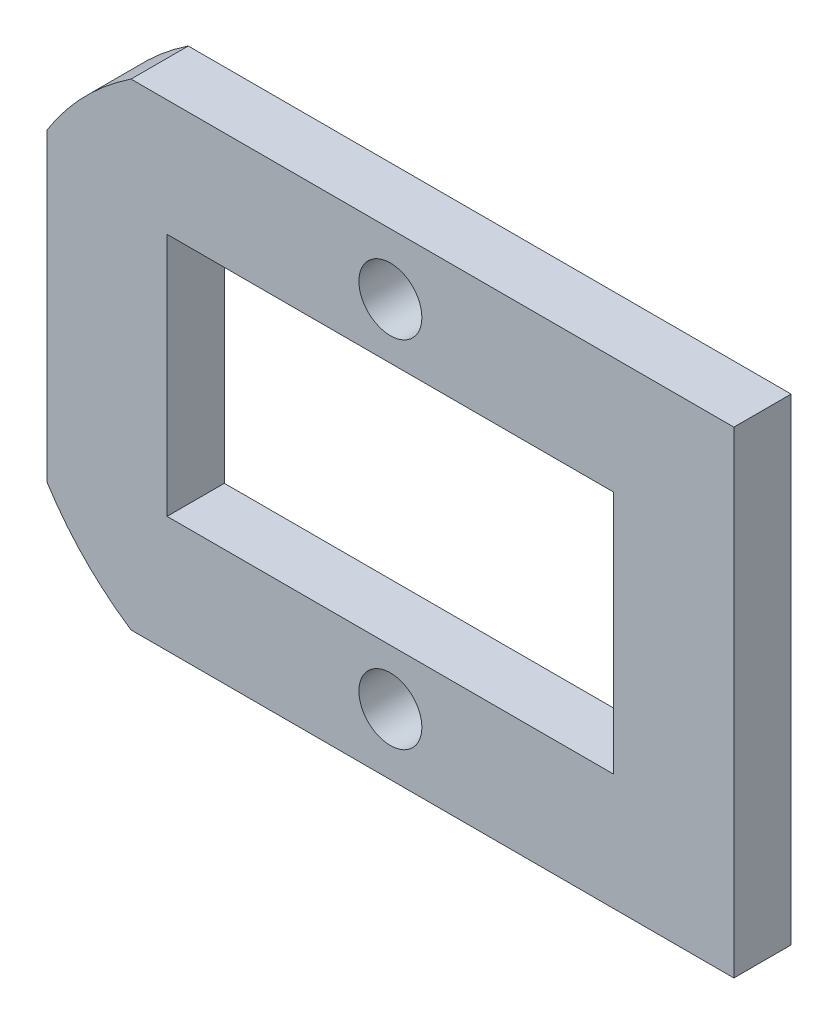
ISO-10303-21;
HEADER;
FILE_DESCRIPTION(('STEP AP214'),'2;1');
FILE_NAME('part.step','',(''),(''),'','','');
FILE_SCHEMA(('AUTOMOTIVE_DESIGN { 1 0 10303 214 1 1 1 1 }'));
ENDSEC;
DATA;
#1=APPLICATION_CONTEXT('core data for automotive mechanical design processes');
#2=APPLICATION_PROTOCOL_DEFINITION('international standard','automotive_design',2000,#1);
#3=PRODUCT_CONTEXT('',#1,'mechanical');
#4=PRODUCT('Part','Part','',(#3));
#5=PRODUCT_RELATED_PRODUCT_CATEGORY('part','',(#4));
#6=PRODUCT_DEFINITION_FORMATION('','',#4);
#7=PRODUCT_DEFINITION_CONTEXT('part definition',#1,'design');
#8=PRODUCT_DEFINITION('design','',#6,#7);
#9=PRODUCT_DEFINITION_SHAPE('','',#8);
#10=(LENGTH_UNIT() NAMED_UNIT(*) SI_UNIT(.MILLI.,.METRE.));
#11=(NAMED_UNIT(*) PLANE_ANGLE_UNIT() SI_UNIT($,.RADIAN.));
#12=(NAMED_UNIT(*) SI_UNIT($,.STERADIAN.) SOLID_ANGLE_UNIT());
#13=UNCERTAINTY_MEASURE_WITH_UNIT(LENGTH_MEASURE(1.E-05),#10,'distance_accuracy_value','');
#14=(GEOMETRIC_REPRESENTATION_CONTEXT(3) GLOBAL_UNCERTAINTY_ASSIGNED_CONTEXT((#13)) GLOBAL_UNIT_ASSIGNED_CONTEXT((#10,
#11,#12)) REPRESENTATION_CONTEXT('',''));
#15=CARTESIAN_POINT('',(0.,0.,0.));
#16=DIRECTION('',(0.,0.,1.));
#17=DIRECTION('',(1.,0.,0.));
#18=AXIS2_PLACEMENT_3D('',#15,#16,#17);
#19=CARTESIAN_POINT('',(-118.1,25.3,-11.45));
#20=DIRECTION('',(0.,0.,1.));
#21=DIRECTION('',(1.,0.,0.));
#22=AXIS2_PLACEMENT_3D('',#19,#20,#21);
#23=CYLINDRICAL_SURFACE('',#22,1.65);
#24=DIRECTION('',(0.,0.,1.));
#25=VECTOR('',#24,1.);
#26=CARTESIAN_POINT('',(-116.45,25.3,-11.45));
#27=LINE('',#26,#25);
#28=CARTESIAN_POINT('',(-116.45,25.3,-10.45));
#29=VERTEX_POINT('',#28);
#30=CARTESIAN_POINT('',(-116.45,25.3,-7.45));
#31=VERTEX_POINT('',#30);
#32=EDGE_CURVE('E10',#29,#31,#27,.T.);
#33=ORIENTED_EDGE('',*,*,#32,.F.);
#34=CARTESIAN_POINT('',(-118.1,25.3,-10.45));
#35=DIRECTION('',(0.,0.,1.));
#36=DIRECTION('',(1.,0.,0.));
#37=AXIS2_PLACEMENT_3D('',#34,#35,#36);
#38=CIRCLE('',#37,1.65);
#39=EDGE_CURVE('E215',#29,#29,#38,.T.);
#40=ORIENTED_EDGE('',*,*,#39,.F.);
#41=ORIENTED_EDGE('',*,*,#32,.T.);
#42=CARTESIAN_POINT('',(-118.1,25.3,-7.45));
#43=DIRECTION('',(0.,0.,1.));
#44=DIRECTION('',(1.,0.,0.));
#45=AXIS2_PLACEMENT_3D('',#42,#43,#44);
#46=CIRCLE('',#45,1.65);
#47=EDGE_CURVE('E146',#31,#31,#46,.T.);
#48=ORIENTED_EDGE('',*,*,#47,.T.);
#49=EDGE_LOOP('',(#33,#40,#41,#48));
#50=FACE_BOUND('',#49,.T.);
#51=ADVANCED_FACE('F15',(#50),#23,.F.);
#52=CARTESIAN_POINT('',(-129.8,22.4,-11.45));
#53=DIRECTION('',(0.,1.,0.));
#54=DIRECTION('',(1.,0.,0.));
#55=AXIS2_PLACEMENT_3D('',#52,#53,#54);
#56=PLANE('',#55);
#57=DIRECTION('',(-1.,0.,0.));
#58=VECTOR('',#57,1.);
#59=CARTESIAN_POINT('',(-132.95,22.4,-7.45));
#60=LINE('',#59,#58);
#61=CARTESIAN_POINT('',(-106.4,22.4,-7.45));
#62=VERTEX_POINT('',#61);
#63=CARTESIAN_POINT('',(-129.8,22.4,-7.45));
#64=VERTEX_POINT('',#63);
#65=EDGE_CURVE('E175',#62,#64,#60,.T.);
#66=ORIENTED_EDGE('',*,*,#65,.T.);
#67=DIRECTION('',(0.,0.,1.));
#68=VECTOR('',#67,1.);
#69=CARTESIAN_POINT('',(-129.8,22.4,-11.45));
#70=LINE('',#69,#68);
#71=CARTESIAN_POINT('',(-129.8,22.4,-10.45));
#72=VERTEX_POINT('',#71);
#73=EDGE_CURVE('E24',#72,#64,#70,.T.);
#74=ORIENTED_EDGE('',*,*,#73,.F.);
#75=DIRECTION('',(-1.,0.,0.));
#76=VECTOR('',#75,1.);
#77=CARTESIAN_POINT('',(-132.95,22.4,-10.45));
#78=LINE('',#77,#76);
#79=CARTESIAN_POINT('',(-106.4,22.4,-10.45));
#80=VERTEX_POINT('',#79);
#81=EDGE_CURVE('E243',#80,#72,#78,.T.);
#82=ORIENTED_EDGE('',*,*,#81,.F.);
#83=DIRECTION('',(0.,0.,1.));
#84=VECTOR('',#83,1.);
#85=CARTESIAN_POINT('',(-106.4,22.4,-11.45));
#86=LINE('',#85,#84);
#87=EDGE_CURVE('E237',#80,#62,#86,.T.);
#88=ORIENTED_EDGE('',*,*,#87,.T.);
#89=EDGE_LOOP('',(#66,#74,#82,#88));
#90=FACE_BOUND('',#89,.T.);
#91=ADVANCED_FACE('F273',(#90),#56,.F.);
#92=CARTESIAN_POINT('',(-129.8,9.6,-11.45));
#93=DIRECTION('',(1.,0.,0.));
#94=DIRECTION('',(0.,1.,0.));
#95=AXIS2_PLACEMENT_3D('',#92,#93,#94);
#96=PLANE('',#95);
#97=DIRECTION('',(0.,0.,1.));
#98=VECTOR('',#97,1.);
#99=CARTESIAN_POINT('',(-129.8,9.6,-11.45));
#100=LINE('',#99,#98);
#101=CARTESIAN_POINT('',(-129.8,9.6,-10.45));
#102=VERTEX_POINT('',#101);
#103=CARTESIAN_POINT('',(-129.8,9.6,-7.45));
#104=VERTEX_POINT('',#103);
#105=EDGE_CURVE('E44',#102,#104,#100,.T.);
#106=ORIENTED_EDGE('',*,*,#105,.F.);
#107=DIRECTION('',(0.,1.,0.));
#108=VECTOR('',#107,1.);
#109=CARTESIAN_POINT('',(-129.8,6.55,-10.45));
#110=LINE('',#109,#108);
#111=EDGE_CURVE('E247',#102,#72,#110,.T.);
#112=ORIENTED_EDGE('',*,*,#111,.T.);
#113=ORIENTED_EDGE('',*,*,#73,.T.);
#114=DIRECTION('',(0.,1.,0.));
#115=VECTOR('',#114,1.);
#116=CARTESIAN_POINT('',(-129.8,6.55,-7.45));
#117=LINE('',#116,#115);
#118=EDGE_CURVE('E171',#104,#64,#117,.T.);
#119=ORIENTED_EDGE('',*,*,#118,.F.);
#120=EDGE_LOOP('',(#106,#112,#113,#119));
#121=FACE_BOUND('',#120,.T.);
#122=ADVANCED_FACE('F17',(#121),#96,.T.);
#123=CARTESIAN_POINT('',(-106.4,9.6,-11.45));
#124=DIRECTION('',(1.,0.,0.));
#125=DIRECTION('',(0.,1.,0.));
#126=AXIS2_PLACEMENT_3D('',#123,#124,#125);
#127=PLANE('',#126);
#128=DIRECTION('',(0.,1.,0.));
#129=VECTOR('',#128,1.);
#130=CARTESIAN_POINT('',(-106.4,6.55,-7.45));
#131=LINE('',#130,#129);
#132=CARTESIAN_POINT('',(-106.4,9.6,-7.45));
#133=VERTEX_POINT('',#132);
#134=EDGE_CURVE('E182',#133,#62,#131,.T.);
#135=ORIENTED_EDGE('',*,*,#134,.T.);
#136=ORIENTED_EDGE('',*,*,#87,.F.);
#137=DIRECTION('',(0.,1.,0.));
#138=VECTOR('',#137,1.);
#139=CARTESIAN_POINT('',(-106.4,6.55,-10.45));
#140=LINE('',#139,#138);
#141=CARTESIAN_POINT('',(-106.4,9.6,-10.45));
#142=VERTEX_POINT('',#141);
#143=EDGE_CURVE('E236',#142,#80,#140,.T.);
#144=ORIENTED_EDGE('',*,*,#143,.F.);
#145=DIRECTION('',(0.,0.,1.));
#146=VECTOR('',#145,1.);
#147=CARTESIAN_POINT('',(-106.4,9.6,-11.45));
#148=LINE('',#147,#146);
#149=EDGE_CURVE('E263',#142,#133,#148,.T.);
#150=ORIENTED_EDGE('',*,*,#149,.T.);
#151=EDGE_LOOP('',(#135,#136,#144,#150));
#152=FACE_BOUND('',#151,.T.);
#153=ADVANCED_FACE('F286',(#152),#127,.F.);
#154=CARTESIAN_POINT('',(-129.8,9.6,-11.45));
#155=DIRECTION('',(0.,1.,0.));
#156=DIRECTION('',(1.,0.,0.));
#157=AXIS2_PLACEMENT_3D('',#154,#155,#156);
#158=PLANE('',#157);
#159=ORIENTED_EDGE('',*,*,#149,.F.);
#160=DIRECTION('',(-1.,0.,0.));
#161=VECTOR('',#160,1.);
#162=CARTESIAN_POINT('',(-132.95,9.6,-10.45));
#163=LINE('',#162,#161);
#164=EDGE_CURVE('E219',#142,#102,#163,.T.);
#165=ORIENTED_EDGE('',*,*,#164,.T.);
#166=ORIENTED_EDGE('',*,*,#105,.T.);
#167=DIRECTION('',(-1.,0.,0.));
#168=VECTOR('',#167,1.);
#169=CARTESIAN_POINT('',(-132.95,9.6,-7.45));
#170=LINE('',#169,#168);
#171=EDGE_CURVE('E176',#133,#104,#170,.T.);
#172=ORIENTED_EDGE('',*,*,#171,.F.);
#173=EDGE_LOOP('',(#159,#165,#166,#172));
#174=FACE_BOUND('',#173,.T.);
#175=ADVANCED_FACE('F280',(#174),#158,.T.);
#176=CARTESIAN_POINT('',(-118.1,6.7,-11.45));
#177=DIRECTION('',(0.,0.,1.));
#178=DIRECTION('',(1.,0.,0.));
#179=AXIS2_PLACEMENT_3D('',#176,#177,#178);
#180=CYLINDRICAL_SURFACE('',#179,1.65);
#181=DIRECTION('',(0.,0.,1.));
#182=VECTOR('',#181,1.);
#183=CARTESIAN_POINT('',(-116.45,6.7,-11.45));
#184=LINE('',#183,#182);
#185=CARTESIAN_POINT('',(-116.45,6.7,-10.45));
#186=VERTEX_POINT('',#185);
#187=CARTESIAN_POINT('',(-116.45,6.7,-7.45));
#188=VERTEX_POINT('',#187);
#189=EDGE_CURVE('E260',#186,#188,#184,.T.);
#190=ORIENTED_EDGE('',*,*,#189,.F.);
#191=CARTESIAN_POINT('',(-118.1,6.7,-10.45));
#192=DIRECTION('',(0.,0.,1.));
#193=DIRECTION('',(1.,0.,0.));
#194=AXIS2_PLACEMENT_3D('',#191,#192,#193);
#195=CIRCLE('',#194,1.65);
#196=EDGE_CURVE('E232',#186,#186,#195,.T.);
#197=ORIENTED_EDGE('',*,*,#196,.F.);
#198=ORIENTED_EDGE('',*,*,#189,.T.);
#199=CARTESIAN_POINT('',(-118.1,6.7,-7.45));
#200=DIRECTION('',(0.,0.,1.));
#201=DIRECTION('',(1.,0.,0.));
#202=AXIS2_PLACEMENT_3D('',#199,#200,#201);
#203=CIRCLE('',#202,1.65);
#204=EDGE_CURVE('E200',#188,#188,#203,.T.);
#205=ORIENTED_EDGE('',*,*,#204,.T.);
#206=EDGE_LOOP('',(#190,#197,#198,#205));
#207=FACE_BOUND('',#206,.T.);
#208=ADVANCED_FACE('F294',(#207),#180,.F.);
#209=CARTESIAN_POINT('',(-136.1,3.5,-10.45));
#210=DIRECTION('',(0.,1.,0.));
#211=DIRECTION('',(1.,0.,0.));
#212=AXIS2_PLACEMENT_3D('',#209,#210,#211);
#213=PLANE('',#212);
#214=DIRECTION('',(0.,0.,1.));
#215=VECTOR('',#214,1.);
#216=CARTESIAN_POINT('',(-100.1,3.5,-10.45));
#217=LINE('',#216,#215);
#218=CARTESIAN_POINT('',(-100.1,3.5,-10.45));
#219=VERTEX_POINT('',#218);
#220=CARTESIAN_POINT('',(-100.1,3.5,-7.45));
#221=VERTEX_POINT('',#220);
#222=EDGE_CURVE('E257',#219,#221,#217,.T.);
#223=ORIENTED_EDGE('',*,*,#222,.T.);
#224=DIRECTION('',(1.,0.,0.));
#225=VECTOR('',#224,1.);
#226=CARTESIAN_POINT('',(-136.1,3.5,-7.45));
#227=LINE('',#226,#225);
#228=CARTESIAN_POINT('',(-131.6915619758,3.5,-7.45));
#229=VERTEX_POINT('',#228);
#230=EDGE_CURVE('E185',#229,#221,#227,.T.);
#231=ORIENTED_EDGE('',*,*,#230,.F.);
#232=DIRECTION('',(0.,0.,1.));
#233=VECTOR('',#232,1.);
#234=CARTESIAN_POINT('',(-131.6915619758,3.5,-11.45));
#235=LINE('',#234,#233);
#236=CARTESIAN_POINT('',(-131.6915619758,3.5,-10.45));
#237=VERTEX_POINT('',#236);
#238=EDGE_CURVE('E218',#237,#229,#235,.T.);
#239=ORIENTED_EDGE('',*,*,#238,.F.);
#240=DIRECTION('',(1.,0.,0.));
#241=VECTOR('',#240,1.);
#242=CARTESIAN_POINT('',(-136.1,3.5,-10.45));
#243=LINE('',#242,#241);
#244=EDGE_CURVE('E201',#237,#219,#243,.T.);
#245=ORIENTED_EDGE('',*,*,#244,.T.);
#246=EDGE_LOOP('',(#223,#231,#239,#245));
#247=FACE_BOUND('',#246,.T.);
#248=ADVANCED_FACE('F322',(#247),#213,.F.);
#249=CARTESIAN_POINT('',(-100.1,3.5,-10.45));
#250=DIRECTION('',(1.,0.,0.));
#251=DIRECTION('',(0.,1.,0.));
#252=AXIS2_PLACEMENT_3D('',#249,#250,#251);
#253=PLANE('',#252);
#254=ORIENTED_EDGE('',*,*,#222,.F.);
#255=DIRECTION('',(0.,1.,0.));
#256=VECTOR('',#255,1.);
#257=CARTESIAN_POINT('',(-100.1,3.5,-10.45));
#258=LINE('',#257,#256);
#259=CARTESIAN_POINT('',(-100.1,28.5,-10.45));
#260=VERTEX_POINT('',#259);
#261=EDGE_CURVE('E205',#219,#260,#258,.T.);
#262=ORIENTED_EDGE('',*,*,#261,.T.);
#263=DIRECTION('',(0.,0.,1.));
#264=VECTOR('',#263,1.);
#265=CARTESIAN_POINT('',(-100.1,28.5,-10.45));
#266=LINE('',#265,#264);
#267=CARTESIAN_POINT('',(-100.1,28.5,-7.45));
#268=VERTEX_POINT('',#267);
#269=EDGE_CURVE('E254',#260,#268,#266,.T.);
#270=ORIENTED_EDGE('',*,*,#269,.T.);
#271=DIRECTION('',(0.,1.,0.));
#272=VECTOR('',#271,1.);
#273=CARTESIAN_POINT('',(-100.1,3.5,-7.45));
#274=LINE('',#273,#272);
#275=EDGE_CURVE('E188',#221,#268,#274,.T.);
#276=ORIENTED_EDGE('',*,*,#275,.F.);
#277=EDGE_LOOP('',(#254,#262,#270,#276));
#278=FACE_BOUND('',#277,.T.);
#279=ADVANCED_FACE('F318',(#278),#253,.T.);
#280=CARTESIAN_POINT('',(-136.1,28.5,-10.45));
#281=DIRECTION('',(0.,1.,0.));
#282=DIRECTION('',(1.,0.,0.));
#283=AXIS2_PLACEMENT_3D('',#280,#281,#282);
#284=PLANE('',#283);
#285=DIRECTION('',(1.,0.,0.));
#286=VECTOR('',#285,1.);
#287=CARTESIAN_POINT('',(-136.1,28.5,-10.45));
#288=LINE('',#287,#286);
#289=CARTESIAN_POINT('',(-131.6915619758,28.5,-10.45));
#290=VERTEX_POINT('',#289);
#291=EDGE_CURVE('E224',#290,#260,#288,.T.);
#292=ORIENTED_EDGE('',*,*,#291,.F.);
#293=DIRECTION('',(0.,0.,1.));
#294=VECTOR('',#293,1.);
#295=CARTESIAN_POINT('',(-131.6915619758,28.5,-11.45));
#296=LINE('',#295,#294);
#297=CARTESIAN_POINT('',(-131.6915619758,28.5,-7.45));
#298=VERTEX_POINT('',#297);
#299=EDGE_CURVE('E142',#290,#298,#296,.T.);
#300=ORIENTED_EDGE('',*,*,#299,.T.);
#301=DIRECTION('',(1.,0.,0.));
#302=VECTOR('',#301,1.);
#303=CARTESIAN_POINT('',(-136.1,28.5,-7.45));
#304=LINE('',#303,#302);
#305=EDGE_CURVE('E193',#298,#268,#304,.T.);
#306=ORIENTED_EDGE('',*,*,#305,.T.);
#307=ORIENTED_EDGE('',*,*,#269,.F.);
#308=EDGE_LOOP('',(#292,#300,#306,#307));
#309=FACE_BOUND('',#308,.T.);
#310=ADVANCED_FACE('F314',(#309),#284,.T.);
#311=CARTESIAN_POINT('',(-123.4,16.,-11.45));
#312=DIRECTION('',(0.,0.,1.));
#313=DIRECTION('',(1.,0.,0.));
#314=AXIS2_PLACEMENT_3D('',#311,#312,#313);
#315=CYLINDRICAL_SURFACE('',#314,15.);
#316=DIRECTION('',(0.,0.,1.));
#317=VECTOR('',#316,1.);
#318=CARTESIAN_POINT('',(-136.1,8.018145578877,-11.45));
#319=LINE('',#318,#317);
#320=CARTESIAN_POINT('',(-136.1,8.018145578877,-10.45));
#321=VERTEX_POINT('',#320);
#322=CARTESIAN_POINT('',(-136.1,8.018145578877,-7.45));
#323=VERTEX_POINT('',#322);
#324=EDGE_CURVE('E158',#321,#323,#319,.T.);
#325=ORIENTED_EDGE('',*,*,#324,.F.);
#326=CARTESIAN_POINT('',(-123.4,16.,-10.45));
#327=DIRECTION('',(0.,0.,1.));
#328=DIRECTION('',(1.,0.,0.));
#329=AXIS2_PLACEMENT_3D('',#326,#327,#328);
#330=CIRCLE('',#329,15.);
#331=EDGE_CURVE('E153',#321,#237,#330,.T.);
#332=ORIENTED_EDGE('',*,*,#331,.T.);
#333=ORIENTED_EDGE('',*,*,#238,.T.);
#334=CARTESIAN_POINT('',(-123.4,16.,-7.45));
#335=DIRECTION('',(0.,0.,1.));
#336=DIRECTION('',(1.,0.,0.));
#337=AXIS2_PLACEMENT_3D('',#334,#335,#336);
#338=CIRCLE('',#337,15.);
#339=EDGE_CURVE('E169',#323,#229,#338,.T.);
#340=ORIENTED_EDGE('',*,*,#339,.F.);
#341=EDGE_LOOP('',(#325,#332,#333,#340));
#342=FACE_BOUND('',#341,.T.);
#343=ADVANCED_FACE('F310',(#342),#315,.T.);
#344=CARTESIAN_POINT('',(-136.1,3.5,-10.45));
#345=DIRECTION('',(0.,0.,1.));
#346=DIRECTION('',(1.,0.,0.));
#347=AXIS2_PLACEMENT_3D('',#344,#345,#346);
#348=PLANE('',#347);
#349=ORIENTED_EDGE('',*,*,#39,.T.);
#350=EDGE_LOOP('',(#349));
#351=FACE_BOUND('',#350,.T.);
#352=ORIENTED_EDGE('',*,*,#143,.T.);
#353=ORIENTED_EDGE('',*,*,#81,.T.);
#354=ORIENTED_EDGE('',*,*,#111,.F.);
#355=ORIENTED_EDGE('',*,*,#164,.F.);
#356=EDGE_LOOP('',(#352,#353,#354,#355));
#357=FACE_BOUND('',#356,.T.);
#358=ORIENTED_EDGE('',*,*,#196,.T.);
#359=EDGE_LOOP('',(#358));
#360=FACE_BOUND('',#359,.T.);
#361=CARTESIAN_POINT('',(-123.4,16.,-10.45));
#362=DIRECTION('',(0.,0.,1.));
#363=DIRECTION('',(1.,0.,0.));
#364=AXIS2_PLACEMENT_3D('',#361,#362,#363);
#365=CIRCLE('',#364,15.);
#366=CARTESIAN_POINT('',(-136.1,23.981854421123,-10.45));
#367=VERTEX_POINT('',#366);
#368=EDGE_CURVE('E136',#290,#367,#365,.T.);
#369=ORIENTED_EDGE('',*,*,#368,.F.);
#370=ORIENTED_EDGE('',*,*,#291,.T.);
#371=ORIENTED_EDGE('',*,*,#261,.F.);
#372=ORIENTED_EDGE('',*,*,#244,.F.);
#373=ORIENTED_EDGE('',*,*,#331,.F.);
#374=DIRECTION('',(0.,1.,0.));
#375=VECTOR('',#374,1.);
#376=CARTESIAN_POINT('',(-136.1,3.5,-10.45));
#377=LINE('',#376,#375);
#378=EDGE_CURVE('E149',#321,#367,#377,.T.);
#379=ORIENTED_EDGE('',*,*,#378,.T.);
#380=EDGE_LOOP('',(#369,#370,#371,#372,#373,#379));
#381=FACE_BOUND('',#380,.T.);
#382=ADVANCED_FACE('F150',(#351,#357,#360,#381),#348,.F.);
#383=CARTESIAN_POINT('',(-123.4,16.,-11.45));
#384=DIRECTION('',(0.,0.,1.));
#385=DIRECTION('',(1.,0.,0.));
#386=AXIS2_PLACEMENT_3D('',#383,#384,#385);
#387=CYLINDRICAL_SURFACE('',#386,15.);
#388=ORIENTED_EDGE('',*,*,#368,.T.);
#389=DIRECTION('',(0.,0.,1.));
#390=VECTOR('',#389,1.);
#391=CARTESIAN_POINT('',(-136.1,23.981854421123,-11.45));
#392=LINE('',#391,#390);
#393=CARTESIAN_POINT('',(-136.1,23.981854421123,-7.45));
#394=VERTEX_POINT('',#393);
#395=EDGE_CURVE('E141',#367,#394,#392,.T.);
#396=ORIENTED_EDGE('',*,*,#395,.T.);
#397=CARTESIAN_POINT('',(-123.4,16.,-7.45));
#398=DIRECTION('',(0.,0.,1.));
#399=DIRECTION('',(1.,0.,0.));
#400=AXIS2_PLACEMENT_3D('',#397,#398,#399);
#401=CIRCLE('',#400,15.);
#402=EDGE_CURVE('E197',#298,#394,#401,.T.);
#403=ORIENTED_EDGE('',*,*,#402,.F.);
#404=ORIENTED_EDGE('',*,*,#299,.F.);
#405=EDGE_LOOP('',(#388,#396,#403,#404));
#406=FACE_BOUND('',#405,.T.);
#407=ADVANCED_FACE('F138',(#406),#387,.T.);
#408=CARTESIAN_POINT('',(-136.1,3.5,-7.45));
#409=DIRECTION('',(0.,0.,1.));
#410=DIRECTION('',(1.,0.,0.));
#411=AXIS2_PLACEMENT_3D('',#408,#409,#410);
#412=PLANE('',#411);
#413=ORIENTED_EDGE('',*,*,#47,.F.);
#414=EDGE_LOOP('',(#413));
#415=FACE_BOUND('',#414,.T.);
#416=ORIENTED_EDGE('',*,*,#171,.T.);
#417=ORIENTED_EDGE('',*,*,#118,.T.);
#418=ORIENTED_EDGE('',*,*,#65,.F.);
#419=ORIENTED_EDGE('',*,*,#134,.F.);
#420=EDGE_LOOP('',(#416,#417,#418,#419));
#421=FACE_BOUND('',#420,.T.);
#422=ORIENTED_EDGE('',*,*,#204,.F.);
#423=EDGE_LOOP('',(#422));
#424=FACE_BOUND('',#423,.T.);
#425=DIRECTION('',(0.,1.,0.));
#426=VECTOR('',#425,1.);
#427=CARTESIAN_POINT('',(-136.1,3.5,-7.45));
#428=LINE('',#427,#426);
#429=EDGE_CURVE('E163',#323,#394,#428,.T.);
#430=ORIENTED_EDGE('',*,*,#429,.F.);
#431=ORIENTED_EDGE('',*,*,#339,.T.);
#432=ORIENTED_EDGE('',*,*,#230,.T.);
#433=ORIENTED_EDGE('',*,*,#275,.T.);
#434=ORIENTED_EDGE('',*,*,#305,.F.);
#435=ORIENTED_EDGE('',*,*,#402,.T.);
#436=EDGE_LOOP('',(#430,#431,#432,#433,#434,#435));
#437=FACE_BOUND('',#436,.T.);
#438=ADVANCED_FACE('F276',(#415,#421,#424,#437),#412,.T.);
#439=CARTESIAN_POINT('',(-136.1,3.5,-10.45));
#440=DIRECTION('',(1.,0.,0.));
#441=DIRECTION('',(0.,1.,0.));
#442=AXIS2_PLACEMENT_3D('',#439,#440,#441);
#443=PLANE('',#442);
#444=ORIENTED_EDGE('',*,*,#395,.F.);
#445=ORIENTED_EDGE('',*,*,#378,.F.);
#446=ORIENTED_EDGE('',*,*,#324,.T.);
#447=ORIENTED_EDGE('',*,*,#429,.T.);
#448=EDGE_LOOP('',(#444,#445,#446,#447));
#449=FACE_BOUND('',#448,.T.);
#450=ADVANCED_FACE('F161',(#449),#443,.F.);
#451=CLOSED_SHELL('',(#51,#91,#122,#153,#175,#208,#248,#279,#310,#343,#382,#407,#438,#450));
#452=MANIFOLD_SOLID_BREP('B1',#451);
#453=ADVANCED_BREP_SHAPE_REPRESENTATION('',(#18,#452),#14);
#454=SHAPE_DEFINITION_REPRESENTATION(#9,#453);
ENDSEC;
END-ISO-10303-21;
